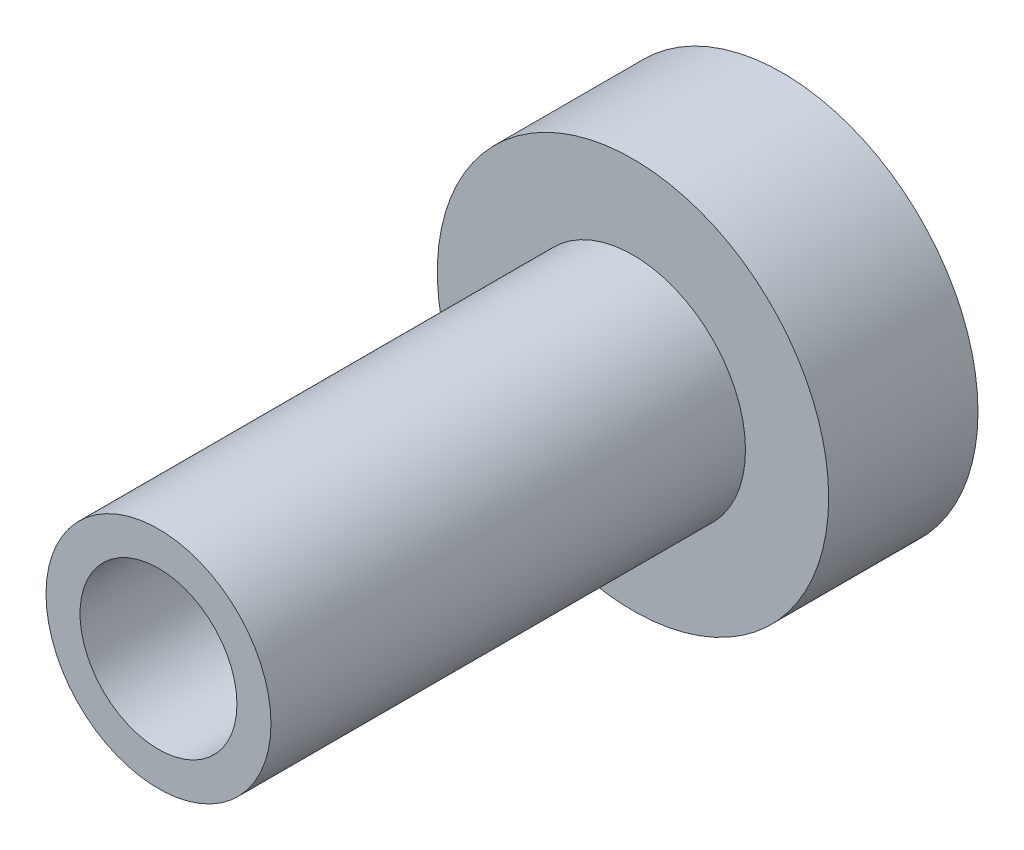
ISO-10303-21;
HEADER;
FILE_DESCRIPTION(('STEP AP214'),'2;1');
FILE_NAME('part.step','',(''),(''),'','','');
FILE_SCHEMA(('AUTOMOTIVE_DESIGN { 1 0 10303 214 1 1 1 1 }'));
ENDSEC;
DATA;
#1=APPLICATION_CONTEXT('core data for automotive mechanical design processes');
#2=APPLICATION_PROTOCOL_DEFINITION('international standard','automotive_design',2000,#1);
#3=PRODUCT_CONTEXT('',#1,'mechanical');
#4=PRODUCT('Part','Part','',(#3));
#5=PRODUCT_RELATED_PRODUCT_CATEGORY('part','',(#4));
#6=PRODUCT_DEFINITION_FORMATION('','',#4);
#7=PRODUCT_DEFINITION_CONTEXT('part definition',#1,'design');
#8=PRODUCT_DEFINITION('design','',#6,#7);
#9=PRODUCT_DEFINITION_SHAPE('','',#8);
#10=(LENGTH_UNIT() NAMED_UNIT(*) SI_UNIT(.MILLI.,.METRE.));
#11=(NAMED_UNIT(*) PLANE_ANGLE_UNIT() SI_UNIT($,.RADIAN.));
#12=(NAMED_UNIT(*) SI_UNIT($,.STERADIAN.) SOLID_ANGLE_UNIT());
#13=UNCERTAINTY_MEASURE_WITH_UNIT(LENGTH_MEASURE(1.E-05),#10,'distance_accuracy_value','');
#14=(GEOMETRIC_REPRESENTATION_CONTEXT(3) GLOBAL_UNCERTAINTY_ASSIGNED_CONTEXT((#13)) GLOBAL_UNIT_ASSIGNED_CONTEXT((#10,
#11,#12)) REPRESENTATION_CONTEXT('',''));
#15=CARTESIAN_POINT('',(0.,0.,0.));
#16=DIRECTION('',(0.,0.,1.));
#17=DIRECTION('',(1.,0.,0.));
#18=AXIS2_PLACEMENT_3D('',#15,#16,#17);
#19=CARTESIAN_POINT('',(0.,0.,33.));
#20=DIRECTION('',(0.,0.,1.));
#21=DIRECTION('',(1.,0.,0.));
#22=AXIS2_PLACEMENT_3D('',#19,#20,#21);
#23=PLANE('',#22);
#24=CARTESIAN_POINT('',(0.,0.,33.));
#25=DIRECTION('',(0.,0.,1.));
#26=DIRECTION('',(1.,0.,0.));
#27=AXIS2_PLACEMENT_3D('',#24,#25,#26);
#28=CIRCLE('',#27,4.15);
#29=CARTESIAN_POINT('',(4.15,0.,33.));
#30=VERTEX_POINT('',#29);
#31=EDGE_CURVE('E38',#30,#30,#28,.T.);
#32=ORIENTED_EDGE('',*,*,#31,.F.);
#33=EDGE_LOOP('',(#32));
#34=FACE_BOUND('',#33,.T.);
#35=CARTESIAN_POINT('',(0.,0.,33.));
#36=DIRECTION('',(0.,0.,1.));
#37=DIRECTION('',(1.,0.,0.));
#38=AXIS2_PLACEMENT_3D('',#35,#36,#37);
#39=CIRCLE('',#38,5.95);
#40=CARTESIAN_POINT('',(5.95,0.,33.));
#41=VERTEX_POINT('',#40);
#42=EDGE_CURVE('E52',#41,#41,#39,.T.);
#43=ORIENTED_EDGE('',*,*,#42,.T.);
#44=EDGE_LOOP('',(#43));
#45=FACE_BOUND('',#44,.T.);
#46=ADVANCED_FACE('F31',(#34,#45),#23,.T.);
#47=CARTESIAN_POINT('',(0.,0.,33.));
#48=DIRECTION('',(0.,0.,-1.));
#49=DIRECTION('',(-1.,0.,0.));
#50=AXIS2_PLACEMENT_3D('',#47,#48,#49);
#51=CYLINDRICAL_SURFACE('',#50,10.35);
#52=CARTESIAN_POINT('',(0.,0.,0.));
#53=DIRECTION('',(0.,0.,1.));
#54=DIRECTION('',(1.,0.,0.));
#55=AXIS2_PLACEMENT_3D('',#52,#53,#54);
#56=CIRCLE('',#55,10.35);
#57=CARTESIAN_POINT('',(10.35,0.,0.));
#58=VERTEX_POINT('',#57);
#59=EDGE_CURVE('E10',#58,#58,#56,.T.);
#60=ORIENTED_EDGE('',*,*,#59,.T.);
#61=EDGE_LOOP('',(#60));
#62=FACE_BOUND('',#61,.T.);
#63=CARTESIAN_POINT('',(0.,0.,7.9));
#64=DIRECTION('',(0.,0.,1.));
#65=DIRECTION('',(1.,0.,0.));
#66=AXIS2_PLACEMENT_3D('',#63,#64,#65);
#67=CIRCLE('',#66,10.35);
#68=CARTESIAN_POINT('',(10.35,0.,7.9));
#69=VERTEX_POINT('',#68);
#70=EDGE_CURVE('E47',#69,#69,#67,.T.);
#71=ORIENTED_EDGE('',*,*,#70,.F.);
#72=EDGE_LOOP('',(#71));
#73=FACE_BOUND('',#72,.T.);
#74=ADVANCED_FACE('F33',(#62,#73),#51,.T.);
#75=CARTESIAN_POINT('',(0.,0.,0.));
#76=DIRECTION('',(0.,0.,1.));
#77=DIRECTION('',(1.,0.,0.));
#78=AXIS2_PLACEMENT_3D('',#75,#76,#77);
#79=PLANE('',#78);
#80=ORIENTED_EDGE('',*,*,#59,.F.);
#81=EDGE_LOOP('',(#80));
#82=FACE_BOUND('',#81,.T.);
#83=CARTESIAN_POINT('',(0.,0.,0.));
#84=DIRECTION('',(0.,0.,1.));
#85=DIRECTION('',(1.,0.,0.));
#86=AXIS2_PLACEMENT_3D('',#83,#84,#85);
#87=CIRCLE('',#86,4.15);
#88=CARTESIAN_POINT('',(4.15,0.,0.));
#89=VERTEX_POINT('',#88);
#90=EDGE_CURVE('E42',#89,#89,#87,.T.);
#91=ORIENTED_EDGE('',*,*,#90,.T.);
#92=EDGE_LOOP('',(#91));
#93=FACE_BOUND('',#92,.T.);
#94=ADVANCED_FACE('F69',(#82,#93),#79,.F.);
#95=CARTESIAN_POINT('',(0.,0.,33.));
#96=DIRECTION('',(0.,0.,-1.));
#97=DIRECTION('',(-1.,0.,0.));
#98=AXIS2_PLACEMENT_3D('',#95,#96,#97);
#99=CYLINDRICAL_SURFACE('',#98,4.15);
#100=ORIENTED_EDGE('',*,*,#31,.T.);
#101=EDGE_LOOP('',(#100));
#102=FACE_BOUND('',#101,.T.);
#103=ORIENTED_EDGE('',*,*,#90,.F.);
#104=EDGE_LOOP('',(#103));
#105=FACE_BOUND('',#104,.T.);
#106=ADVANCED_FACE('F64',(#102,#105),#99,.F.);
#107=CARTESIAN_POINT('',(0.,0.,7.9));
#108=DIRECTION('',(0.,0.,1.));
#109=DIRECTION('',(1.,0.,0.));
#110=AXIS2_PLACEMENT_3D('',#107,#108,#109);
#111=PLANE('',#110);
#112=CARTESIAN_POINT('',(0.,0.,7.9));
#113=DIRECTION('',(0.,0.,1.));
#114=DIRECTION('',(1.,0.,0.));
#115=AXIS2_PLACEMENT_3D('',#112,#113,#114);
#116=CIRCLE('',#115,5.95);
#117=CARTESIAN_POINT('',(5.95,0.,7.9));
#118=VERTEX_POINT('',#117);
#119=EDGE_CURVE('E51',#118,#118,#116,.T.);
#120=ORIENTED_EDGE('',*,*,#119,.F.);
#121=EDGE_LOOP('',(#120));
#122=FACE_BOUND('',#121,.T.);
#123=ORIENTED_EDGE('',*,*,#70,.T.);
#124=EDGE_LOOP('',(#123));
#125=FACE_BOUND('',#124,.T.);
#126=ADVANCED_FACE('F61',(#122,#125),#111,.T.);
#127=CARTESIAN_POINT('',(0.,0.,7.9));
#128=DIRECTION('',(0.,0.,1.));
#129=DIRECTION('',(1.,0.,0.));
#130=AXIS2_PLACEMENT_3D('',#127,#128,#129);
#131=CYLINDRICAL_SURFACE('',#130,5.95);
#132=ORIENTED_EDGE('',*,*,#119,.T.);
#133=EDGE_LOOP('',(#132));
#134=FACE_BOUND('',#133,.T.);
#135=ORIENTED_EDGE('',*,*,#42,.F.);
#136=EDGE_LOOP('',(#135));
#137=FACE_BOUND('',#136,.T.);
#138=ADVANCED_FACE('F58',(#134,#137),#131,.T.);
#139=CLOSED_SHELL('',(#46,#74,#94,#106,#126,#138));
#140=MANIFOLD_SOLID_BREP('B2',#139);
#141=ADVANCED_BREP_SHAPE_REPRESENTATION('',(#18,#140),#14);
#142=SHAPE_DEFINITION_REPRESENTATION(#9,#141);
ENDSEC;
END-ISO-10303-21;
